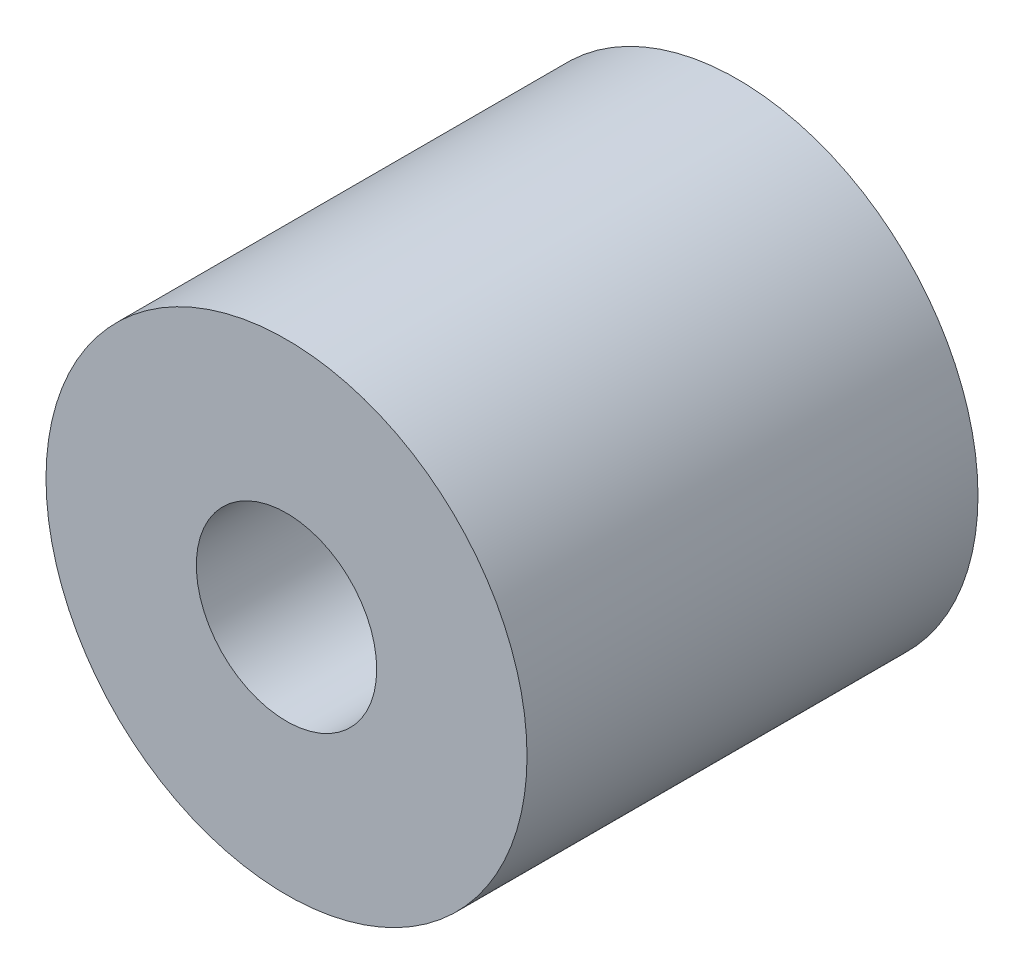
ISO-10303-21;
HEADER;
FILE_DESCRIPTION(('STEP AP214'),'2;1');
FILE_NAME('part.step','',(''),(''),'','','');
FILE_SCHEMA(('AUTOMOTIVE_DESIGN { 1 0 10303 214 1 1 1 1 }'));
ENDSEC;
DATA;
#1=APPLICATION_CONTEXT('core data for automotive mechanical design processes');
#2=APPLICATION_PROTOCOL_DEFINITION('international standard','automotive_design',2000,#1);
#3=PRODUCT_CONTEXT('',#1,'mechanical');
#4=PRODUCT('Part','Part','',(#3));
#5=PRODUCT_RELATED_PRODUCT_CATEGORY('part','',(#4));
#6=PRODUCT_DEFINITION_FORMATION('','',#4);
#7=PRODUCT_DEFINITION_CONTEXT('part definition',#1,'design');
#8=PRODUCT_DEFINITION('design','',#6,#7);
#9=PRODUCT_DEFINITION_SHAPE('','',#8);
#10=(LENGTH_UNIT() NAMED_UNIT(*) SI_UNIT(.MILLI.,.METRE.));
#11=(NAMED_UNIT(*) PLANE_ANGLE_UNIT() SI_UNIT($,.RADIAN.));
#12=(NAMED_UNIT(*) SI_UNIT($,.STERADIAN.) SOLID_ANGLE_UNIT());
#13=UNCERTAINTY_MEASURE_WITH_UNIT(LENGTH_MEASURE(1.E-05),#10,'distance_accuracy_value','');
#14=(GEOMETRIC_REPRESENTATION_CONTEXT(3) GLOBAL_UNCERTAINTY_ASSIGNED_CONTEXT((#13)) GLOBAL_UNIT_ASSIGNED_CONTEXT((#10,
#11,#12)) REPRESENTATION_CONTEXT('',''));
#15=CARTESIAN_POINT('',(0.,0.,0.));
#16=DIRECTION('',(0.,0.,1.));
#17=DIRECTION('',(1.,0.,0.));
#18=AXIS2_PLACEMENT_3D('',#15,#16,#17);
#19=CARTESIAN_POINT('',(0.,0.,7.5));
#20=DIRECTION('',(0.,0.,1.));
#21=DIRECTION('',(1.,0.,0.));
#22=AXIS2_PLACEMENT_3D('',#19,#20,#21);
#23=PLANE('',#22);
#24=CARTESIAN_POINT('',(0.,0.,7.5));
#25=DIRECTION('',(0.,0.,1.));
#26=DIRECTION('',(1.,0.,0.));
#27=AXIS2_PLACEMENT_3D('',#24,#25,#26);
#28=CIRCLE('',#27,8.);
#29=CARTESIAN_POINT('',(8.,0.,7.5));
#30=VERTEX_POINT('',#29);
#31=EDGE_CURVE('E10',#30,#30,#28,.T.);
#32=ORIENTED_EDGE('',*,*,#31,.T.);
#33=EDGE_LOOP('',(#32));
#34=FACE_BOUND('',#33,.T.);
#35=CARTESIAN_POINT('',(0.,0.,7.5));
#36=DIRECTION('',(0.,0.,1.));
#37=DIRECTION('',(1.,0.,0.));
#38=AXIS2_PLACEMENT_3D('',#35,#36,#37);
#39=CIRCLE('',#38,3.);
#40=CARTESIAN_POINT('',(3.,0.,7.5));
#41=VERTEX_POINT('',#40);
#42=EDGE_CURVE('E46',#41,#41,#39,.T.);
#43=ORIENTED_EDGE('',*,*,#42,.F.);
#44=EDGE_LOOP('',(#43));
#45=FACE_BOUND('',#44,.T.);
#46=ADVANCED_FACE('F35',(#34,#45),#23,.T.);
#47=CARTESIAN_POINT('',(0.,0.,-7.5));
#48=DIRECTION('',(0.,0.,1.));
#49=DIRECTION('',(1.,0.,0.));
#50=AXIS2_PLACEMENT_3D('',#47,#48,#49);
#51=PLANE('',#50);
#52=CARTESIAN_POINT('',(0.,0.,-7.5));
#53=DIRECTION('',(0.,0.,1.));
#54=DIRECTION('',(1.,0.,0.));
#55=AXIS2_PLACEMENT_3D('',#52,#53,#54);
#56=CIRCLE('',#55,8.);
#57=CARTESIAN_POINT('',(8.,0.,-7.5));
#58=VERTEX_POINT('',#57);
#59=EDGE_CURVE('E39',#58,#58,#56,.T.);
#60=ORIENTED_EDGE('',*,*,#59,.F.);
#61=EDGE_LOOP('',(#60));
#62=FACE_BOUND('',#61,.T.);
#63=CARTESIAN_POINT('',(0.,0.,-7.5));
#64=DIRECTION('',(0.,0.,1.));
#65=DIRECTION('',(1.,0.,0.));
#66=AXIS2_PLACEMENT_3D('',#63,#64,#65);
#67=CIRCLE('',#66,3.);
#68=CARTESIAN_POINT('',(3.,0.,-7.5));
#69=VERTEX_POINT('',#68);
#70=EDGE_CURVE('E48',#69,#69,#67,.T.);
#71=ORIENTED_EDGE('',*,*,#70,.T.);
#72=EDGE_LOOP('',(#71));
#73=FACE_BOUND('',#72,.T.);
#74=ADVANCED_FACE('F58',(#62,#73),#51,.F.);
#75=CARTESIAN_POINT('',(0.,0.,7.5));
#76=DIRECTION('',(0.,0.,-1.));
#77=DIRECTION('',(-1.,0.,0.));
#78=AXIS2_PLACEMENT_3D('',#75,#76,#77);
#79=CYLINDRICAL_SURFACE('',#78,8.);
#80=ORIENTED_EDGE('',*,*,#31,.F.);
#81=EDGE_LOOP('',(#80));
#82=FACE_BOUND('',#81,.T.);
#83=ORIENTED_EDGE('',*,*,#59,.T.);
#84=EDGE_LOOP('',(#83));
#85=FACE_BOUND('',#84,.T.);
#86=ADVANCED_FACE('F37',(#82,#85),#79,.T.);
#87=CARTESIAN_POINT('',(0.,0.,7.5));
#88=DIRECTION('',(0.,0.,-1.));
#89=DIRECTION('',(-1.,0.,0.));
#90=AXIS2_PLACEMENT_3D('',#87,#88,#89);
#91=CYLINDRICAL_SURFACE('',#90,3.);
#92=ORIENTED_EDGE('',*,*,#42,.T.);
#93=EDGE_LOOP('',(#92));
#94=FACE_BOUND('',#93,.T.);
#95=ORIENTED_EDGE('',*,*,#70,.F.);
#96=EDGE_LOOP('',(#95));
#97=FACE_BOUND('',#96,.T.);
#98=ADVANCED_FACE('F54',(#94,#97),#91,.F.);
#99=CLOSED_SHELL('',(#46,#74,#86,#98));
#100=MANIFOLD_SOLID_BREP('B2',#99);
#101=ADVANCED_BREP_SHAPE_REPRESENTATION('',(#18,#100),#14);
#102=SHAPE_DEFINITION_REPRESENTATION(#9,#101);
ENDSEC;
END-ISO-10303-21;
